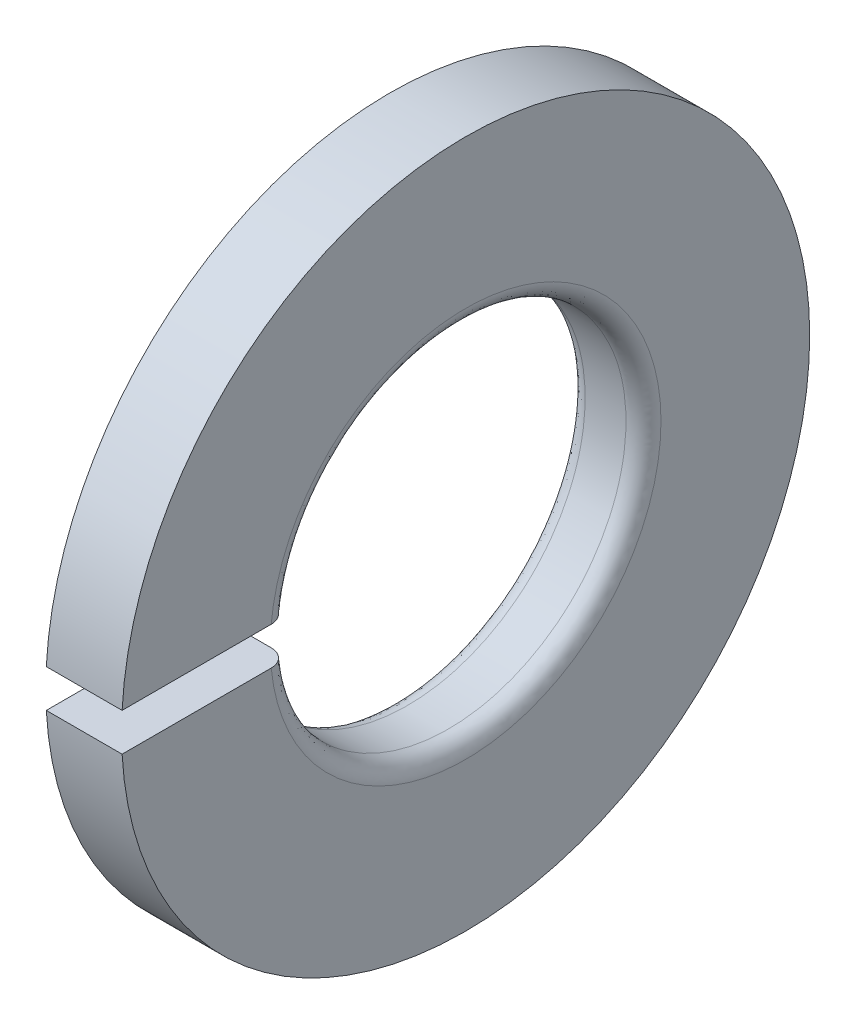
ISO-10303-21;
HEADER;
FILE_DESCRIPTION(('STEP AP214'),'2;1');
FILE_NAME('part.step','',(''),(''),'','','');
FILE_SCHEMA(('AUTOMOTIVE_DESIGN { 1 0 10303 214 1 1 1 1 }'));
ENDSEC;
DATA;
#1=APPLICATION_CONTEXT('core data for automotive mechanical design processes');
#2=APPLICATION_PROTOCOL_DEFINITION('international standard','automotive_design',2000,#1);
#3=PRODUCT_CONTEXT('',#1,'mechanical');
#4=PRODUCT('Part','Part','',(#3));
#5=PRODUCT_RELATED_PRODUCT_CATEGORY('part','',(#4));
#6=PRODUCT_DEFINITION_FORMATION('','',#4);
#7=PRODUCT_DEFINITION_CONTEXT('part definition',#1,'design');
#8=PRODUCT_DEFINITION('design','',#6,#7);
#9=PRODUCT_DEFINITION_SHAPE('','',#8);
#10=(LENGTH_UNIT() NAMED_UNIT(*) SI_UNIT(.MILLI.,.METRE.));
#11=(NAMED_UNIT(*) PLANE_ANGLE_UNIT() SI_UNIT($,.RADIAN.));
#12=(NAMED_UNIT(*) SI_UNIT($,.STERADIAN.) SOLID_ANGLE_UNIT());
#13=UNCERTAINTY_MEASURE_WITH_UNIT(LENGTH_MEASURE(1.E-05),#10,'distance_accuracy_value','');
#14=(GEOMETRIC_REPRESENTATION_CONTEXT(3) GLOBAL_UNCERTAINTY_ASSIGNED_CONTEXT((#13)) GLOBAL_UNIT_ASSIGNED_CONTEXT((#10,
#11,#12)) REPRESENTATION_CONTEXT('',''));
#15=CARTESIAN_POINT('',(0.,0.,0.));
#16=DIRECTION('',(0.,0.,1.));
#17=DIRECTION('',(1.,0.,0.));
#18=AXIS2_PLACEMENT_3D('',#15,#16,#17);
#19=CARTESIAN_POINT('',(-0.3,0.,0.));
#20=DIRECTION('',(-1.,0.,0.));
#21=DIRECTION('',(0.,0.,1.));
#22=AXIS2_PLACEMENT_3D('',#19,#20,#21);
#23=CYLINDRICAL_SURFACE('',#22,3.05);
#24=DIRECTION('',(-1.,0.,0.));
#25=VECTOR('',#24,1.);
#26=CARTESIAN_POINT('',(-0.65,-0.325,3.032634993));
#27=LINE('',#26,#25);
#28=CARTESIAN_POINT('',(-0.300000000053715,-0.325,3.032634993));
#29=VERTEX_POINT('',#28);
#30=CARTESIAN_POINT('',(-1.00000000019257,-0.325,3.03263498874584));
#31=VERTEX_POINT('',#30);
#32=EDGE_CURVE('E65',#29,#31,#27,.T.);
#33=ORIENTED_EDGE('',*,*,#32,.F.);
#34=CARTESIAN_POINT('',(-0.29999999980743,0.,-8.12906512936973E-09));
#35=DIRECTION('',(-1.,0.,0.));
#36=DIRECTION('',(0.,0.,1.));
#37=AXIS2_PLACEMENT_3D('',#34,#35,#36);
#38=CIRCLE('',#37,3.04999999974882);
#39=CARTESIAN_POINT('',(-0.299999999903716,0.325000000138988,3.03263498866762));
#40=VERTEX_POINT('',#39);
#41=EDGE_CURVE('E87',#40,#29,#38,.T.);
#42=ORIENTED_EDGE('',*,*,#41,.F.);
#43=DIRECTION('',(1.,0.,0.));
#44=VECTOR('',#43,1.);
#45=CARTESIAN_POINT('',(-0.65,0.325000000277976,3.03263499284357));
#46=LINE('',#45,#44);
#47=CARTESIAN_POINT('',(-1.00000000009629,0.325000000138988,3.03263498866763));
#48=VERTEX_POINT('',#47);
#49=EDGE_CURVE('E70',#40,#48,#46,.F.);
#50=ORIENTED_EDGE('',*,*,#49,.T.);
#51=CARTESIAN_POINT('',(-1.00000000019257,0.,-8.12905255262453E-09));
#52=DIRECTION('',(1.,0.,0.));
#53=DIRECTION('',(0.,0.,-1.));
#54=AXIS2_PLACEMENT_3D('',#51,#52,#53);
#55=CIRCLE('',#54,3.04999999974882);
#56=EDGE_CURVE('E68',#31,#48,#55,.T.);
#57=ORIENTED_EDGE('',*,*,#56,.F.);
#58=EDGE_LOOP('',(#33,#42,#50,#57));
#59=FACE_BOUND('',#58,.T.);
#60=ADVANCED_FACE('F16',(#59),#23,.F.);
#61=CARTESIAN_POINT('',(-0.970049975,0.184913225,3.045890957));
#62=CARTESIAN_POINT('',(-0.970049975,5.925849379,2.69736403));
#63=CARTESIAN_POINT('',(-0.970049975,5.751505799,-3.05149875));
#64=CARTESIAN_POINT('',(-0.970049975,0.,-3.05149875));
#65=CARTESIAN_POINT('',(-0.970049975,-5.751505799,-3.05149875));
#66=CARTESIAN_POINT('',(-0.970049975,-5.925849379,2.69736403));
#67=CARTESIAN_POINT('',(-0.970049975,-0.184913225,3.045890957));
#68=CARTESIAN_POINT('',(-1.17401613,0.183673104,3.025463689));
#69=CARTESIAN_POINT('',(-1.17401613,5.886107669,2.679274157));
#70=CARTESIAN_POINT('',(-1.17401613,5.712933323,-3.031033873));
#71=CARTESIAN_POINT('',(-1.17401613,0.,-3.031033873));
#72=CARTESIAN_POINT('',(-1.17401613,-5.712933323,-3.031033873));
#73=CARTESIAN_POINT('',(-1.17401613,-5.886107669,2.679274157));
#74=CARTESIAN_POINT('',(-1.17401613,-0.183673104,3.025463689));
#75=CARTESIAN_POINT('',(-1.318966127,0.192456713,3.170147309));
#76=CARTESIAN_POINT('',(-1.318966127,6.167592906,2.807402314));
#77=CARTESIAN_POINT('',(-1.318966127,5.986137024,-3.17598387));
#78=CARTESIAN_POINT('',(-1.318966127,0.,-3.17598387));
#79=CARTESIAN_POINT('',(-1.318966127,-5.986137024,-3.17598387));
#80=CARTESIAN_POINT('',(-1.318966127,-6.167592906,2.807402314));
#81=CARTESIAN_POINT('',(-1.318966127,-0.192456713,3.170147309));
#82=CARTESIAN_POINT('',(-1.29850125,0.204816554,3.373738631));
#83=CARTESIAN_POINT('',(-1.29850125,6.563684404,2.987697642));
#84=CARTESIAN_POINT('',(-1.29850125,6.370575169,-3.379950025));
#85=CARTESIAN_POINT('',(-1.29850125,0.,-3.379950025));
#86=CARTESIAN_POINT('',(-1.29850125,-6.370575169,-3.379950025));
#87=CARTESIAN_POINT('',(-1.29850125,-6.563684404,2.987697642));
#88=CARTESIAN_POINT('',(-1.29850125,-0.204816554,3.373738631));
#89=(BOUNDED_SURFACE() B_SPLINE_SURFACE(3,3,((#61,#62,#63,#64,#65,#66,#67),(#68,#69,#70,#71,#72,
#73,#74),(#75,#76,#77,#78,#79,#80,#81),(#82,#83,#84,#85,#86,#87,#88)),.UNSPECIFIED.,.F.,.F.,
.F.) B_SPLINE_SURFACE_WITH_KNOTS((4,4),(4,3,4),(0.,1.),(0.,0.5,1.),
.UNSPECIFIED.) GEOMETRIC_REPRESENTATION_ITEM() RATIONAL_B_SPLINE_SURFACE(((1.,0.353541789658432,
0.353541789658432,1.,0.353541789658432,0.353541789658432,1.),(0.75532087111797,
0.267037492541413,0.267037492541413,0.75532087111797,0.267037492541413,0.267037492541413,
0.75532087111797),(0.75532087111797,0.267037492541413,0.267037492541413,0.75532087111797,
0.267037492541413,0.267037492541413,0.75532087111797),(1.,0.353541789658432,0.353541789658432,
1.,0.353541789658432,0.353541789658432,1.))) REPRESENTATION_ITEM('') SURFACE());
#90=CARTESIAN_POINT('',(-1.30000000038587,0.203001657064488,3.34384364560761));
#91=CARTESIAN_POINT('',(-1.30000000038587,6.50552303725771,2.96122339867174));
#92=CARTESIAN_POINT('',(-1.30000000038587,6.31412495973926,-3.34999999980743));
#93=CARTESIAN_POINT('',(-1.30000000038587,0.,-3.34999999980743));
#94=CARTESIAN_POINT('',(-1.30000000038587,-6.31412495973926,-3.34999999980743));
#95=CARTESIAN_POINT('',(-1.30000000038587,-6.50552303725771,2.96122339867174));
#96=CARTESIAN_POINT('',(-1.30000000038587,-0.203001657064488,3.34384364560761));
#97=(BOUNDED_CURVE() B_SPLINE_CURVE(3,(#90,#91,#92,#93,#94,#95,#96),.UNSPECIFIED.,.F.,
.F.) B_SPLINE_CURVE_WITH_KNOTS((4,3,4),(0.,0.5,1.),
.UNSPECIFIED.) CURVE() GEOMETRIC_REPRESENTATION_ITEM() RATIONAL_B_SPLINE_CURVE((0.956578302165992,
0.338190404896189,0.338190404896189,0.956578302165992,0.338190404896189,0.338190404896189,0.956578302165992)) REPRESENTATION_ITEM(''));
#98=CARTESIAN_POINT('',(-1.30000000015435,0.32499999508112,3.33419780297463));
#99=VERTEX_POINT('',#98);
#100=CARTESIAN_POINT('',(-1.30000000015435,-0.32499999508112,3.33419780297463));
#101=VERTEX_POINT('',#100);
#102=EDGE_CURVE('E82',#99,#101,#97,.T.);
#103=CARTESIAN_POINT('',(-0.999999999946285,-0.325,3.03263499279372));
#104=CARTESIAN_POINT('',(-1.0168099313794,-0.324999999999992,3.03262022058277));
#105=CARTESIAN_POINT('',(-1.03361495664269,-0.324999999999996,3.03405505274268));
#106=CARTESIAN_POINT('',(-1.06673277802023,-0.325000000000004,3.03971415636966));
#107=CARTESIAN_POINT('',(-1.08304602955642,-0.325000000000008,3.04393575854949));
#108=CARTESIAN_POINT('',(-1.11473847899273,-0.324999999999992,3.05506135195133));
#109=CARTESIAN_POINT('',(-1.13011728176661,-0.324999999999972,3.06196646887956));
#110=CARTESIAN_POINT('',(-1.15949970422998,-0.325000000000028,3.07825194527598));
#111=CARTESIAN_POINT('',(-1.17350349731573,-0.325000000000104,3.08763199209042));
#112=CARTESIAN_POINT('',(-1.19978392888974,-0.325000000000104,3.10862725274518));
#113=CARTESIAN_POINT('',(-1.21205574219759,-0.325000000000028,3.12024850555979));
#114=CARTESIAN_POINT('',(-1.2344868286867,-0.324999999999972,3.14537705043612));
#115=CARTESIAN_POINT('',(-1.24464604332895,-0.324999999999993,3.15888439474311));
#116=CARTESIAN_POINT('',(-1.26262229582032,-0.325000000000008,3.18748027737932));
#117=CARTESIAN_POINT('',(-1.27042601982254,-0.325000000000002,3.20257717634607));
#118=CARTESIAN_POINT('',(-1.28339693331156,-0.324999999999998,3.23386022258014));
#119=CARTESIAN_POINT('',(-1.28856549786506,-0.324999999999999,3.25004579675853));
#120=CARTESIAN_POINT('',(-1.29488945583863,-0.325,3.27763444811843));
#121=CARTESIAN_POINT('',(-1.29680463163051,-0.325,3.28886936318855));
#122=CARTESIAN_POINT('',(-1.29935978954663,-0.325,3.31146726494677));
#123=CARTESIAN_POINT('',(-1.30000155743509,-0.325,3.32283004978052));
#124=CARTESIAN_POINT('',(-1.30000000038587,-0.325000000000001,3.33419780297464));
#125=B_SPLINE_CURVE_WITH_KNOTS('',3,(#103,#104,#105,#106,#107,#108,#109,#110,#111,#112,#113,
#114,#115,#116,#117,#118,#119,#120,#121,#122,#123,#124),.UNSPECIFIED.,.F.,.F.,(4,2,2,2,2,2,2,2,
2,2,4),(0.,0.0503615206928303,0.100674872830711,0.151009353712364,0.201337478965316,
0.251803158476537,0.302270236179118,0.353017443916103,0.40373814380805,0.437861545283411,
0.471937059873951),.UNSPECIFIED.);
#126=EDGE_CURVE('E78',#31,#101,#125,.T.);
#127=CARTESIAN_POINT('',(-1.30000000038587,0.325,3.33419780297463));
#128=CARTESIAN_POINT('',(-1.30001401957163,0.324999999999997,3.31717184240235));
#129=CARTESIAN_POINT('',(-1.29856505137026,0.324999999999999,3.30014991497731));
#130=CARTESIAN_POINT('',(-1.29284552360367,0.325000000000001,3.2665979058188));
#131=CARTESIAN_POINT('',(-1.28857683483866,0.325000000000003,3.25006750556564));
#132=CARTESIAN_POINT('',(-1.2773191323299,0.324999999999998,3.21795034083385));
#133=CARTESIAN_POINT('',(-1.27032873580392,0.324999999999991,3.20236406068074));
#134=CARTESIAN_POINT('',(-1.25382823415304,0.325000000000009,3.17259189081591));
#135=CARTESIAN_POINT('',(-1.24431864692542,0.325000000000033,3.1584057140916));
#136=CARTESIAN_POINT('',(-1.22306178207738,0.325000000000033,3.13186116272638));
#137=CARTESIAN_POINT('',(-1.21131825219241,0.325000000000009,3.11949978756034));
#138=CARTESIAN_POINT('',(-1.18591374643896,0.324999999999991,3.09693605998352));
#139=CARTESIAN_POINT('',(-1.17225288727957,0.324999999999998,3.08673357625434));
#140=CARTESIAN_POINT('',(-1.14346809582329,0.325000000000002,3.06882709645421));
#141=CARTESIAN_POINT('',(-1.12835097867201,0.325000000000001,3.0611121325778));
#142=CARTESIAN_POINT('',(-1.09703483531182,0.324999999999999,3.0483489866981));
#143=CARTESIAN_POINT('',(-1.08083653719747,0.325,3.04329903002047));
#144=CARTESIAN_POINT('',(-1.0537753311025,0.325,3.03732208661016));
#145=CARTESIAN_POINT('',(-1.04308846338233,0.325,3.0355654999419));
#146=CARTESIAN_POINT('',(-1.0216026238256,0.325,3.03322214384115));
#147=CARTESIAN_POINT('',(-1.0108038326107,0.325,3.03263371775206));
#148=CARTESIAN_POINT('',(-1.00000000002129,0.325,3.03263499279372));
#149=B_SPLINE_CURVE_WITH_KNOTS('',3,(#127,#128,#129,#130,#131,#132,#133,#134,#135,#136,#137,
#138,#139,#140,#141,#142,#143,#144,#145,#146,#147,#148),.UNSPECIFIED.,.F.,.F.,(4,2,2,2,2,2,2,2,
2,2,4),(0.,0.0510106469232434,0.101987483756677,0.152990253587105,0.203982546352298,
0.254890035408988,0.305794427036747,0.356471203704867,0.407114191112237,0.43954588297321,
0.471931548056649),.UNSPECIFIED.);
#150=EDGE_CURVE('E135',#99,#48,#149,.T.);
#151=ORIENTED_EDGE('',*,*,#102,.T.);
#152=ORIENTED_EDGE('',*,*,#126,.F.);
#153=ORIENTED_EDGE('',*,*,#56,.T.);
#154=ORIENTED_EDGE('',*,*,#150,.F.);
#155=EDGE_LOOP('',(#151,#152,#153,#154));
#156=FACE_BOUND('',#155,.T.);
#157=ADVANCED_FACE('F79',(#156),#89,.T.);
#158=CARTESIAN_POINT('',(-1.3,-0.325,3.032634993));
#159=DIRECTION('',(0.,1.,0.));
#160=DIRECTION('',(0.,0.,1.));
#161=AXIS2_PLACEMENT_3D('',#158,#159,#160);
#162=PLANE('',#161);
#163=ORIENTED_EDGE('',*,*,#126,.T.);
#164=DIRECTION('',(0.,0.,1.));
#165=VECTOR('',#164,1.);
#166=CARTESIAN_POINT('',(-1.3,-0.324999994272799,-0.0044790359999998));
#167=LINE('',#166,#165);
#168=CARTESIAN_POINT('',(-1.3,-0.324999997136399,5.89104192826603));
#169=VERTEX_POINT('',#168);
#170=EDGE_CURVE('E184',#101,#169,#167,.T.);
#171=ORIENTED_EDGE('',*,*,#170,.T.);
#172=DIRECTION('',(1.,0.,0.));
#173=VECTOR('',#172,1.);
#174=CARTESIAN_POINT('',(-0.65,-0.325,5.891041928));
#175=LINE('',#174,#173);
#176=CARTESIAN_POINT('',(0.,-0.324999997136399,5.89104192826603));
#177=VERTEX_POINT('',#176);
#178=EDGE_CURVE('E74',#169,#177,#175,.T.);
#179=ORIENTED_EDGE('',*,*,#178,.T.);
#180=DIRECTION('',(0.,0.,-1.));
#181=VECTOR('',#180,1.);
#182=CARTESIAN_POINT('',(0.,-0.324999994272799,-0.0044790359999998));
#183=LINE('',#182,#181);
#184=CARTESIAN_POINT('',(1.54346903992959E-10,-0.32499999508112,3.33419780297463));
#185=VERTEX_POINT('',#184);
#186=EDGE_CURVE('E187',#177,#185,#183,.T.);
#187=ORIENTED_EDGE('',*,*,#186,.T.);
#188=CARTESIAN_POINT('',(-0.300000000053715,-0.325,3.03263499279372));
#189=CARTESIAN_POINT('',(-0.283190068620633,-0.324999999999995,3.03262022058277));
#190=CARTESIAN_POINT('',(-0.266385043357385,-0.324999999999998,3.03405505274267));
#191=CARTESIAN_POINT('',(-0.233267221979913,-0.325000000000002,3.03971415636963));
#192=CARTESIAN_POINT('',(-0.216953970443756,-0.325000000000005,3.04393575854944));
#193=CARTESIAN_POINT('',(-0.185261521007512,-0.324999999999997,3.05506135195123));
#194=CARTESIAN_POINT('',(-0.169882718233659,-0.324999999999986,3.06196646887943));
#195=CARTESIAN_POINT('',(-0.140500295770341,-0.325000000000014,3.07825194527578));
#196=CARTESIAN_POINT('',(-0.126496502684602,-0.325000000000052,3.08763199209019));
#197=CARTESIAN_POINT('',(-0.100216071110598,-0.325000000000052,3.10862725274488));
#198=CARTESIAN_POINT('',(-0.087944257802731,-0.325000000000014,3.12024850555948));
#199=CARTESIAN_POINT('',(-0.0655131713135839,-0.324999999999986,3.14537705043576));
#200=CARTESIAN_POINT('',(-0.0553539566713099,-0.324999999999996,3.15888439474274));
#201=CARTESIAN_POINT('',(-0.0373777041798958,-0.325000000000003,3.18748027737892));
#202=CARTESIAN_POINT('',(-0.0295739801776543,-0.325000000000001,3.20257717634567));
#203=CARTESIAN_POINT('',(-0.0166030666885855,-0.324999999999999,3.23386022257971));
#204=CARTESIAN_POINT('',(-0.0114345021350688,-0.325,3.25004579675809));
#205=CARTESIAN_POINT('',(-0.00511054416144102,-0.325,3.27763444811806));
#206=CARTESIAN_POINT('',(-0.00319536836953697,-0.325,3.28886936318825));
#207=CARTESIAN_POINT('',(-0.000640210453375813,-0.325,3.31146726494662));
#208=CARTESIAN_POINT('',(1.55743509020739E-06,-0.325,3.32283004978044));
#209=CARTESIAN_POINT('',(3.85867254138316E-10,-0.325,3.33419780297464));
#210=B_SPLINE_CURVE_WITH_KNOTS('',3,(#188,#189,#190,#191,#192,#193,#194,#195,#196,#197,#198,
#199,#200,#201,#202,#203,#204,#205,#206,#207,#208,#209),.UNSPECIFIED.,.F.,.F.,(4,2,2,2,2,2,2,2,
2,2,4),(0.,0.0503615206927191,0.100674872830489,0.15100935371203,0.201337478964871,
0.251803158476091,0.302270236178672,0.353017443915655,0.403738143807599,0.437861545283186,
0.471937059873952),.UNSPECIFIED.);
#211=EDGE_CURVE('E91',#29,#185,#210,.T.);
#212=ORIENTED_EDGE('',*,*,#211,.F.);
#213=ORIENTED_EDGE('',*,*,#32,.T.);
#214=EDGE_LOOP('',(#163,#171,#179,#187,#212,#213));
#215=FACE_BOUND('',#214,.T.);
#216=ADVANCED_FACE('F88',(#215),#162,.T.);
#217=CARTESIAN_POINT('',(-0.00149875,0.204816554,3.373738631));
#218=CARTESIAN_POINT('',(-0.00149875,6.563684404,2.987697642));
#219=CARTESIAN_POINT('',(-0.00149875,6.370575169,-3.379950025));
#220=CARTESIAN_POINT('',(-0.00149875,0.,-3.379950025));
#221=CARTESIAN_POINT('',(-0.00149875,-6.370575169,-3.379950025));
#222=CARTESIAN_POINT('',(-0.00149875,-6.563684404,2.987697642));
#223=CARTESIAN_POINT('',(-0.00149875,-0.204816554,3.373738631));
#224=CARTESIAN_POINT('',(0.018966127,0.192456713,3.170147309));
#225=CARTESIAN_POINT('',(0.018966127,6.167592906,2.807402314));
#226=CARTESIAN_POINT('',(0.018966127,5.986137024,-3.17598387));
#227=CARTESIAN_POINT('',(0.018966127,0.,-3.17598387));
#228=CARTESIAN_POINT('',(0.018966127,-5.986137024,-3.17598387));
#229=CARTESIAN_POINT('',(0.018966127,-6.167592906,2.807402314));
#230=CARTESIAN_POINT('',(0.018966127,-0.192456713,3.170147309));
#231=CARTESIAN_POINT('',(-0.12598387,0.183673104,3.025463689));
#232=CARTESIAN_POINT('',(-0.12598387,5.886107669,2.679274157));
#233=CARTESIAN_POINT('',(-0.12598387,5.712933323,-3.031033873));
#234=CARTESIAN_POINT('',(-0.12598387,0.,-3.031033873));
#235=CARTESIAN_POINT('',(-0.12598387,-5.712933323,-3.031033873));
#236=CARTESIAN_POINT('',(-0.12598387,-5.886107669,2.679274157));
#237=CARTESIAN_POINT('',(-0.12598387,-0.183673104,3.025463689));
#238=CARTESIAN_POINT('',(-0.329950025,0.184913225,3.045890957));
#239=CARTESIAN_POINT('',(-0.329950025,5.925849379,2.69736403));
#240=CARTESIAN_POINT('',(-0.329950025,5.751505799,-3.05149875));
#241=CARTESIAN_POINT('',(-0.329950025,0.,-3.05149875));
#242=CARTESIAN_POINT('',(-0.329950025,-5.751505799,-3.05149875));
#243=CARTESIAN_POINT('',(-0.329950025,-5.925849379,2.69736403));
#244=CARTESIAN_POINT('',(-0.329950025,-0.184913225,3.045890957));
#245=(BOUNDED_SURFACE() B_SPLINE_SURFACE(3,3,((#217,#218,#219,#220,#221,#222,#223),(#224,#225,
#226,#227,#228,#229,#230),(#231,#232,#233,#234,#235,#236,#237),(#238,#239,#240,#241,#242,#243,
#244)),.UNSPECIFIED.,.F.,.F.,.F.) B_SPLINE_SURFACE_WITH_KNOTS((4,4),(4,3,4),(0.,1.),(0.,0.5,1.),
.UNSPECIFIED.) GEOMETRIC_REPRESENTATION_ITEM() RATIONAL_B_SPLINE_SURFACE(((1.,0.353541789658432,
0.353541789658432,1.,0.353541789658432,0.353541789658432,1.),(0.755320871117971,
0.267037492541413,0.267037492541413,0.755320871117971,0.267037492541413,0.267037492541413,
0.755320871117971),(0.755320871117971,0.267037492541413,0.267037492541413,0.755320871117971,
0.267037492541413,0.267037492541413,0.755320871117971),(1.,0.353541789658432,0.353541789658432,
1.,0.353541789658432,0.353541789658432,1.))) REPRESENTATION_ITEM('') SURFACE());
#246=CARTESIAN_POINT('',(3.85867260138864E-10,-0.203001657064488,3.34384364560761));
#247=CARTESIAN_POINT('',(3.85867257557629E-10,-6.50552303725772,2.96122339867174));
#248=CARTESIAN_POINT('',(3.85867257557629E-10,-6.31412495973926,-3.34999999980743));
#249=CARTESIAN_POINT('',(3.85867260138864E-10,0.,-3.34999999980743));
#250=CARTESIAN_POINT('',(3.85867257557629E-10,6.31412495973926,-3.34999999980743));
#251=CARTESIAN_POINT('',(3.85867257557629E-10,6.50552303725772,2.96122339867174));
#252=CARTESIAN_POINT('',(3.85867260138864E-10,0.203001657064488,3.34384364560761));
#253=(BOUNDED_CURVE() B_SPLINE_CURVE(3,(#246,#247,#248,#249,#250,#251,#252),.UNSPECIFIED.,.F.,
.F.) B_SPLINE_CURVE_WITH_KNOTS((4,3,4),(0.,0.5,1.),
.UNSPECIFIED.) CURVE() GEOMETRIC_REPRESENTATION_ITEM() RATIONAL_B_SPLINE_CURVE((0.956578302165993,
0.33819040489619,0.33819040489619,0.956578302165993,0.33819040489619,0.33819040489619,0.956578302165993)) REPRESENTATION_ITEM(''));
#254=CARTESIAN_POINT('',(1.54346903992959E-10,0.32499999508112,3.33419780297463));
#255=VERTEX_POINT('',#254);
#256=EDGE_CURVE('E172',#185,#255,#253,.T.);
#257=CARTESIAN_POINT('',(-0.299999999978715,0.325,3.03263499279372));
#258=CARTESIAN_POINT('',(-0.283190068545593,0.324999999999992,3.032620220587));
#259=CARTESIAN_POINT('',(-0.26638504328267,0.324999999999996,3.03405505275113));
#260=CARTESIAN_POINT('',(-0.233267221906551,0.325000000000004,3.03971415638643));
#261=CARTESIAN_POINT('',(-0.21695397037142,0.325000000000008,3.04393575857036));
#262=CARTESIAN_POINT('',(-0.185261520937908,0.324999999999992,3.05506135198015));
#263=CARTESIAN_POINT('',(-0.16988271816576,0.324999999999972,3.06196646891223));
#264=CARTESIAN_POINT('',(-0.140500295706476,0.325000000000028,3.07825194531601));
#265=CARTESIAN_POINT('',(-0.126496502623066,0.325000000000103,3.08763199213395));
#266=CARTESIAN_POINT('',(-0.100216071054258,0.325000000000103,3.10862725279531));
#267=CARTESIAN_POINT('',(-0.0879442577492647,0.325000000000028,3.12024850561302));
#268=CARTESIAN_POINT('',(-0.0655131712663445,0.324999999999973,3.14537705049503));
#269=CARTESIAN_POINT('',(-0.0553539566274243,0.324999999999993,3.15888439480461));
#270=CARTESIAN_POINT('',(-0.0373777041431138,0.325000000000008,3.18748027744542));
#271=CARTESIAN_POINT('',(-0.0295739801446271,0.325000000000002,3.2025771764142));
#272=CARTESIAN_POINT('',(-0.0166030666633713,0.324999999999998,3.23386022265163));
#273=CARTESIAN_POINT('',(-0.0114345021139079,0.325,3.25004579683137));
#274=CARTESIAN_POINT('',(-0.0051105441500459,0.325000000000001,3.2776344481806));
#275=CARTESIAN_POINT('',(-0.0031953683624035,0.325,3.28886936323858));
#276=CARTESIAN_POINT('',(-0.00064021045194565,0.325,3.31146726497203));
#277=CARTESIAN_POINT('',(1.55743507821483E-06,0.325,3.32283004979315));
#278=CARTESIAN_POINT('',(3.85867254527118E-10,0.325,3.33419780297463));
#279=B_SPLINE_CURVE_WITH_KNOTS('',3,(#257,#258,#259,#260,#261,#262,#263,#264,#265,#266,#267,
#268,#269,#270,#271,#272,#273,#274,#275,#276,#277,#278),.UNSPECIFIED.,.F.,.F.,(4,2,2,2,2,2,2,2,
2,2,4),(0.,0.0503615206928273,0.100674872830708,0.151009353712356,0.201337478965299,
0.251803158476703,0.302270236179466,0.353017443916694,0.403738143808791,0.43786154524636,
0.471937059799068),.UNSPECIFIED.);
#280=EDGE_CURVE('E151',#40,#255,#279,.T.);
#281=ORIENTED_EDGE('',*,*,#41,.T.);
#282=ORIENTED_EDGE('',*,*,#211,.T.);
#283=ORIENTED_EDGE('',*,*,#256,.T.);
#284=ORIENTED_EDGE('',*,*,#280,.F.);
#285=EDGE_LOOP('',(#281,#282,#283,#284));
#286=FACE_BOUND('',#285,.T.);
#287=ADVANCED_FACE('F115',(#286),#245,.T.);
#288=CARTESIAN_POINT('',(-1.3,0.325,5.891041928));
#289=DIRECTION('',(0.,-1.,0.));
#290=DIRECTION('',(0.,0.,-1.));
#291=AXIS2_PLACEMENT_3D('',#288,#289,#290);
#292=PLANE('',#291);
#293=ORIENTED_EDGE('',*,*,#280,.T.);
#294=DIRECTION('',(0.,0.,1.));
#295=VECTOR('',#294,1.);
#296=CARTESIAN_POINT('',(0.,0.324999994272799,-0.0044790359999998));
#297=LINE('',#296,#295);
#298=CARTESIAN_POINT('',(0.,0.324999997136399,5.89104192826603));
#299=VERTEX_POINT('',#298);
#300=EDGE_CURVE('E155',#255,#299,#297,.T.);
#301=ORIENTED_EDGE('',*,*,#300,.T.);
#302=DIRECTION('',(-1.,0.,0.));
#303=VECTOR('',#302,1.);
#304=CARTESIAN_POINT('',(-0.65,0.325,5.891041928));
#305=LINE('',#304,#303);
#306=CARTESIAN_POINT('',(-1.3,0.324999997136399,5.89104192826603));
#307=VERTEX_POINT('',#306);
#308=EDGE_CURVE('E41',#299,#307,#305,.T.);
#309=ORIENTED_EDGE('',*,*,#308,.T.);
#310=DIRECTION('',(0.,0.,-1.));
#311=VECTOR('',#310,1.);
#312=CARTESIAN_POINT('',(-1.3,0.324999994272799,-0.0044790359999998));
#313=LINE('',#312,#311);
#314=EDGE_CURVE('E183',#307,#99,#313,.T.);
#315=ORIENTED_EDGE('',*,*,#314,.T.);
#316=ORIENTED_EDGE('',*,*,#150,.T.);
#317=ORIENTED_EDGE('',*,*,#49,.F.);
#318=EDGE_LOOP('',(#293,#301,#309,#315,#316,#317));
#319=FACE_BOUND('',#318,.T.);
#320=ADVANCED_FACE('F138',(#319),#292,.T.);
#321=CARTESIAN_POINT('',(-1.3,-5.9708,5.96178818));
#322=DIRECTION('',(1.,0.,0.));
#323=DIRECTION('',(0.,0.,-1.));
#324=AXIS2_PLACEMENT_3D('',#321,#322,#323);
#325=PLANE('',#324);
#326=CARTESIAN_POINT('',(-1.3,0.,0.));
#327=DIRECTION('',(-1.,0.,0.));
#328=DIRECTION('',(0.,0.,1.));
#329=AXIS2_PLACEMENT_3D('',#326,#327,#328);
#330=CIRCLE('',#329,5.9);
#331=EDGE_CURVE('E32',#307,#169,#330,.T.);
#332=ORIENTED_EDGE('',*,*,#331,.T.);
#333=ORIENTED_EDGE('',*,*,#170,.F.);
#334=ORIENTED_EDGE('',*,*,#102,.F.);
#335=ORIENTED_EDGE('',*,*,#314,.F.);
#336=EDGE_LOOP('',(#332,#333,#334,#335));
#337=FACE_BOUND('',#336,.T.);
#338=ADVANCED_FACE('F141',(#337),#325,.F.);
#339=CARTESIAN_POINT('',(0.,-5.9708,-5.970746252));
#340=DIRECTION('',(-1.,0.,0.));
#341=DIRECTION('',(0.,0.,1.));
#342=AXIS2_PLACEMENT_3D('',#339,#340,#341);
#343=PLANE('',#342);
#344=ORIENTED_EDGE('',*,*,#256,.F.);
#345=ORIENTED_EDGE('',*,*,#186,.F.);
#346=CARTESIAN_POINT('',(0.,0.,0.));
#347=DIRECTION('',(-1.,0.,0.));
#348=DIRECTION('',(0.,0.,1.));
#349=AXIS2_PLACEMENT_3D('',#346,#347,#348);
#350=CIRCLE('',#349,5.9);
#351=EDGE_CURVE('E11',#177,#299,#350,.F.);
#352=ORIENTED_EDGE('',*,*,#351,.T.);
#353=ORIENTED_EDGE('',*,*,#300,.F.);
#354=EDGE_LOOP('',(#344,#345,#352,#353));
#355=FACE_BOUND('',#354,.T.);
#356=ADVANCED_FACE('F18',(#355),#343,.F.);
#357=CARTESIAN_POINT('',(0.,0.,0.));
#358=DIRECTION('',(-1.,0.,0.));
#359=DIRECTION('',(0.,0.,1.));
#360=AXIS2_PLACEMENT_3D('',#357,#358,#359);
#361=CYLINDRICAL_SURFACE('',#360,5.9);
#362=ORIENTED_EDGE('',*,*,#351,.F.);
#363=ORIENTED_EDGE('',*,*,#178,.F.);
#364=ORIENTED_EDGE('',*,*,#331,.F.);
#365=ORIENTED_EDGE('',*,*,#308,.F.);
#366=EDGE_LOOP('',(#362,#363,#364,#365));
#367=FACE_BOUND('',#366,.T.);
#368=ADVANCED_FACE('F205',(#367),#361,.T.);
#369=CLOSED_SHELL('',(#60,#157,#216,#287,#320,#338,#356,#368));
#370=MANIFOLD_SOLID_BREP('B1',#369);
#371=ADVANCED_BREP_SHAPE_REPRESENTATION('',(#18,#370),#14);
#372=SHAPE_DEFINITION_REPRESENTATION(#9,#371);
ENDSEC;
END-ISO-10303-21;
